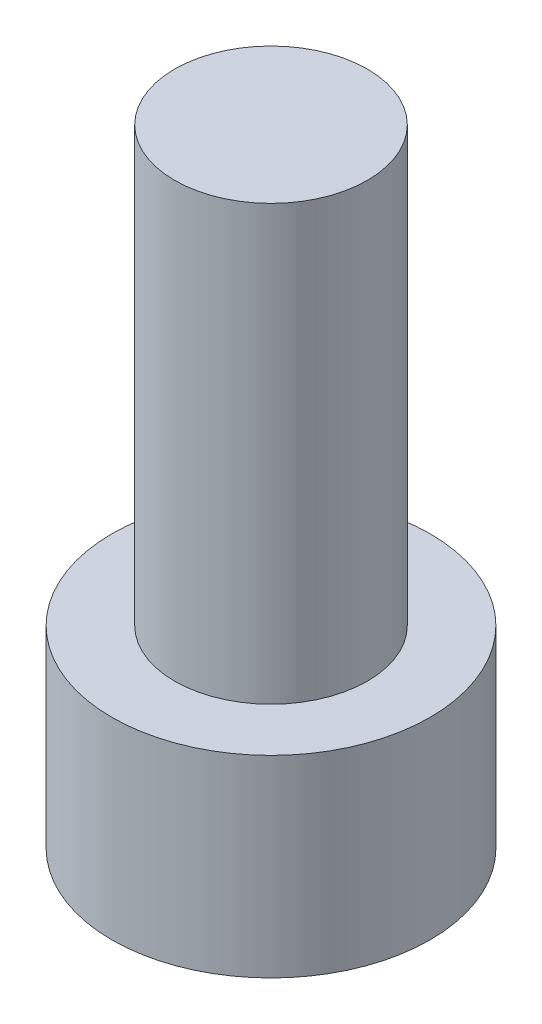
ISO-10303-21;
HEADER;
FILE_DESCRIPTION(('STEP AP214'),'2;1');
FILE_NAME('part.step','',(''),(''),'','','');
FILE_SCHEMA(('AUTOMOTIVE_DESIGN { 1 0 10303 214 1 1 1 1 }'));
ENDSEC;
DATA;
#1=APPLICATION_CONTEXT('core data for automotive mechanical design processes');
#2=APPLICATION_PROTOCOL_DEFINITION('international standard','automotive_design',2000,#1);
#3=PRODUCT_CONTEXT('',#1,'mechanical');
#4=PRODUCT('Part','Part','',(#3));
#5=PRODUCT_RELATED_PRODUCT_CATEGORY('part','',(#4));
#6=PRODUCT_DEFINITION_FORMATION('','',#4);
#7=PRODUCT_DEFINITION_CONTEXT('part definition',#1,'design');
#8=PRODUCT_DEFINITION('design','',#6,#7);
#9=PRODUCT_DEFINITION_SHAPE('','',#8);
#10=(LENGTH_UNIT() NAMED_UNIT(*) SI_UNIT(.MILLI.,.METRE.));
#11=(NAMED_UNIT(*) PLANE_ANGLE_UNIT() SI_UNIT($,.RADIAN.));
#12=(NAMED_UNIT(*) SI_UNIT($,.STERADIAN.) SOLID_ANGLE_UNIT());
#13=UNCERTAINTY_MEASURE_WITH_UNIT(LENGTH_MEASURE(1.E-05),#10,'distance_accuracy_value','');
#14=(GEOMETRIC_REPRESENTATION_CONTEXT(3) GLOBAL_UNCERTAINTY_ASSIGNED_CONTEXT((#13)) GLOBAL_UNIT_ASSIGNED_CONTEXT((#10,
#11,#12)) REPRESENTATION_CONTEXT('',''));
#15=CARTESIAN_POINT('',(0.,0.,0.));
#16=DIRECTION('',(0.,0.,1.));
#17=DIRECTION('',(1.,0.,0.));
#18=AXIS2_PLACEMENT_3D('',#15,#16,#17);
#19=CARTESIAN_POINT('',(0.,8.,0.));
#20=DIRECTION('',(0.,-1.,0.));
#21=DIRECTION('',(0.,0.,-1.));
#22=AXIS2_PLACEMENT_3D('',#19,#20,#21);
#23=CYLINDRICAL_SURFACE('',#22,6.6);
#24=CARTESIAN_POINT('',(0.,8.,0.));
#25=DIRECTION('',(0.,1.,0.));
#26=DIRECTION('',(0.,0.,1.));
#27=AXIS2_PLACEMENT_3D('',#24,#25,#26);
#28=CIRCLE('',#27,6.6);
#29=CARTESIAN_POINT('',(0.,8.,6.6));
#30=VERTEX_POINT('',#29);
#31=EDGE_CURVE('E51',#30,#30,#28,.T.);
#32=ORIENTED_EDGE('',*,*,#31,.F.);
#33=EDGE_LOOP('',(#32));
#34=FACE_BOUND('',#33,.T.);
#35=CARTESIAN_POINT('',(0.,0.,0.));
#36=DIRECTION('',(0.,1.,0.));
#37=DIRECTION('',(0.,0.,1.));
#38=AXIS2_PLACEMENT_3D('',#35,#36,#37);
#39=CIRCLE('',#38,6.6);
#40=CARTESIAN_POINT('',(0.,0.,6.6));
#41=VERTEX_POINT('',#40);
#42=EDGE_CURVE('E46',#41,#41,#39,.T.);
#43=ORIENTED_EDGE('',*,*,#42,.T.);
#44=EDGE_LOOP('',(#43));
#45=FACE_BOUND('',#44,.T.);
#46=ADVANCED_FACE('F43',(#34,#45),#23,.T.);
#47=CARTESIAN_POINT('',(0.,8.,0.));
#48=DIRECTION('',(0.,1.,0.));
#49=DIRECTION('',(0.,0.,1.));
#50=AXIS2_PLACEMENT_3D('',#47,#48,#49);
#51=PLANE('',#50);
#52=CARTESIAN_POINT('',(0.,8.,0.));
#53=DIRECTION('',(0.,1.,0.));
#54=DIRECTION('',(0.,0.,1.));
#55=AXIS2_PLACEMENT_3D('',#52,#53,#54);
#56=CIRCLE('',#55,4.);
#57=CARTESIAN_POINT('',(0.,8.,4.));
#58=VERTEX_POINT('',#57);
#59=EDGE_CURVE('E11',#58,#58,#56,.T.);
#60=ORIENTED_EDGE('',*,*,#59,.F.);
#61=EDGE_LOOP('',(#60));
#62=FACE_BOUND('',#61,.T.);
#63=ORIENTED_EDGE('',*,*,#31,.T.);
#64=EDGE_LOOP('',(#63));
#65=FACE_BOUND('',#64,.T.);
#66=ADVANCED_FACE('F162',(#62,#65),#51,.T.);
#67=CARTESIAN_POINT('',(0.,0.,0.));
#68=DIRECTION('',(0.,1.,0.));
#69=DIRECTION('',(0.,0.,1.));
#70=AXIS2_PLACEMENT_3D('',#67,#68,#69);
#71=PLANE('',#70);
#72=DIRECTION('',(-0.538335131951045,0.,0.842730850098209));
#73=VECTOR('',#72,1.);
#74=CARTESIAN_POINT('',(3.46061635033313,0.,0.155352746377327));
#75=LINE('',#74,#73);
#76=CARTESIAN_POINT('',(3.46061635033313,0.,0.155352746377328));
#77=VERTEX_POINT('',#76);
#78=CARTESIAN_POINT('',(1.59576875025612,0.,3.07465804532895));
#79=VERTEX_POINT('',#78);
#80=EDGE_CURVE('E135',#77,#79,#75,.T.);
#81=ORIENTED_EDGE('',*,*,#80,.F.);
#82=DIRECTION('',(0.460658758762382,0.,0.887577325068358));
#83=VECTOR('',#82,1.);
#84=CARTESIAN_POINT('',(1.86484760007701,0.,-2.91930529895162));
#85=LINE('',#84,#83);
#86=CARTESIAN_POINT('',(1.86484760007701,0.,-2.91930529895162));
#87=VERTEX_POINT('',#86);
#88=EDGE_CURVE('E56',#87,#77,#85,.T.);
#89=ORIENTED_EDGE('',*,*,#88,.F.);
#90=DIRECTION('',(0.998993890713428,0.,0.0448464749701485));
#91=VECTOR('',#90,1.);
#92=CARTESIAN_POINT('',(-1.59576875025612,0.,-3.07465804532894));
#93=LINE('',#92,#91);
#94=CARTESIAN_POINT('',(-1.59576875025612,0.,-3.07465804532894));
#95=VERTEX_POINT('',#94);
#96=EDGE_CURVE('E142',#95,#87,#93,.T.);
#97=ORIENTED_EDGE('',*,*,#96,.F.);
#98=DIRECTION('',(0.538335131951046,0.,-0.842730850098209));
#99=VECTOR('',#98,1.);
#100=CARTESIAN_POINT('',(-3.46061635033313,0.,-0.155352746377328));
#101=LINE('',#100,#99);
#102=CARTESIAN_POINT('',(-3.46061635033313,0.,-0.155352746377328));
#103=VERTEX_POINT('',#102);
#104=EDGE_CURVE('E138',#103,#95,#101,.T.);
#105=ORIENTED_EDGE('',*,*,#104,.F.);
#106=DIRECTION('',(-0.460658758762382,0.,-0.887577325068358));
#107=VECTOR('',#106,1.);
#108=CARTESIAN_POINT('',(-1.86484760007701,0.,2.91930529895162));
#109=LINE('',#108,#107);
#110=CARTESIAN_POINT('',(-1.86484760007701,0.,2.91930529895162));
#111=VERTEX_POINT('',#110);
#112=EDGE_CURVE('E110',#111,#103,#109,.T.);
#113=ORIENTED_EDGE('',*,*,#112,.F.);
#114=DIRECTION('',(-0.998993890713428,0.,-0.0448464749701483));
#115=VECTOR('',#114,1.);
#116=CARTESIAN_POINT('',(1.59576875025612,0.,3.07465804532895));
#117=LINE('',#116,#115);
#118=EDGE_CURVE('E137',#79,#111,#117,.T.);
#119=ORIENTED_EDGE('',*,*,#118,.F.);
#120=EDGE_LOOP('',(#81,#89,#97,#105,#113,#119));
#121=FACE_BOUND('',#120,.T.);
#122=ORIENTED_EDGE('',*,*,#42,.F.);
#123=EDGE_LOOP('',(#122));
#124=FACE_BOUND('',#123,.T.);
#125=ADVANCED_FACE('F159',(#121,#124),#71,.F.);
#126=CARTESIAN_POINT('',(0.,26.,0.));
#127=DIRECTION('',(0.,-1.,0.));
#128=DIRECTION('',(0.,0.,-1.));
#129=AXIS2_PLACEMENT_3D('',#126,#127,#128);
#130=CYLINDRICAL_SURFACE('',#129,4.);
#131=CARTESIAN_POINT('',(0.,26.,0.));
#132=DIRECTION('',(0.,1.,0.));
#133=DIRECTION('',(0.,0.,1.));
#134=AXIS2_PLACEMENT_3D('',#131,#132,#133);
#135=CIRCLE('',#134,4.);
#136=CARTESIAN_POINT('',(0.,26.,4.));
#137=VERTEX_POINT('',#136);
#138=EDGE_CURVE('E148',#137,#137,#135,.T.);
#139=ORIENTED_EDGE('',*,*,#138,.F.);
#140=EDGE_LOOP('',(#139));
#141=FACE_BOUND('',#140,.T.);
#142=ORIENTED_EDGE('',*,*,#59,.T.);
#143=EDGE_LOOP('',(#142));
#144=FACE_BOUND('',#143,.T.);
#145=ADVANCED_FACE('F165',(#141,#144),#130,.T.);
#146=CARTESIAN_POINT('',(0.,26.,0.));
#147=DIRECTION('',(0.,1.,0.));
#148=DIRECTION('',(0.,0.,1.));
#149=AXIS2_PLACEMENT_3D('',#146,#147,#148);
#150=PLANE('',#149);
#151=ORIENTED_EDGE('',*,*,#138,.T.);
#152=EDGE_LOOP('',(#151));
#153=FACE_BOUND('',#152,.T.);
#154=ADVANCED_FACE('F168',(#153),#150,.T.);
#155=CARTESIAN_POINT('',(1.86484760007701,4.,-2.91930529895162));
#156=DIRECTION('',(0.887577325068358,0.,-0.460658758762382));
#157=DIRECTION('',(-0.460658758762382,0.,-0.887577325068358));
#158=AXIS2_PLACEMENT_3D('',#155,#156,#157);
#159=PLANE('',#158);
#160=ORIENTED_EDGE('',*,*,#88,.T.);
#161=DIRECTION('',(0.,-1.,0.));
#162=VECTOR('',#161,1.);
#163=CARTESIAN_POINT('',(3.46061635033313,4.,0.155352746377327));
#164=LINE('',#163,#162);
#165=CARTESIAN_POINT('',(3.46061635033313,4.,0.155352746377327));
#166=VERTEX_POINT('',#165);
#167=EDGE_CURVE('E90',#166,#77,#164,.T.);
#168=ORIENTED_EDGE('',*,*,#167,.F.);
#169=DIRECTION('',(0.460658758762382,0.,0.887577325068358));
#170=VECTOR('',#169,1.);
#171=CARTESIAN_POINT('',(1.86484760007701,4.,-2.91930529895162));
#172=LINE('',#171,#170);
#173=CARTESIAN_POINT('',(1.86484760007701,4.,-2.91930529895162));
#174=VERTEX_POINT('',#173);
#175=EDGE_CURVE('E145',#174,#166,#172,.T.);
#176=ORIENTED_EDGE('',*,*,#175,.F.);
#177=DIRECTION('',(0.,-1.,0.));
#178=VECTOR('',#177,1.);
#179=CARTESIAN_POINT('',(1.86484760007701,4.,-2.91930529895162));
#180=LINE('',#179,#178);
#181=EDGE_CURVE('E70',#174,#87,#180,.T.);
#182=ORIENTED_EDGE('',*,*,#181,.T.);
#183=EDGE_LOOP('',(#160,#168,#176,#182));
#184=FACE_BOUND('',#183,.T.);
#185=ADVANCED_FACE('F196',(#184),#159,.F.);
#186=CARTESIAN_POINT('',(-1.59576875025612,4.,-3.07465804532894));
#187=DIRECTION('',(0.0448464749701485,0.,-0.998993890713428));
#188=DIRECTION('',(-0.998993890713428,0.,-0.0448464749701485));
#189=AXIS2_PLACEMENT_3D('',#186,#187,#188);
#190=PLANE('',#189);
#191=ORIENTED_EDGE('',*,*,#96,.T.);
#192=ORIENTED_EDGE('',*,*,#181,.F.);
#193=DIRECTION('',(0.998993890713428,0.,0.0448464749701485));
#194=VECTOR('',#193,1.);
#195=CARTESIAN_POINT('',(-1.59576875025612,4.,-3.07465804532894));
#196=LINE('',#195,#194);
#197=CARTESIAN_POINT('',(-1.59576875025612,4.,-3.07465804532894));
#198=VERTEX_POINT('',#197);
#199=EDGE_CURVE('E116',#198,#174,#196,.T.);
#200=ORIENTED_EDGE('',*,*,#199,.F.);
#201=DIRECTION('',(0.,-1.,0.));
#202=VECTOR('',#201,1.);
#203=CARTESIAN_POINT('',(-1.59576875025612,4.,-3.07465804532894));
#204=LINE('',#203,#202);
#205=EDGE_CURVE('E112',#198,#95,#204,.T.);
#206=ORIENTED_EDGE('',*,*,#205,.T.);
#207=EDGE_LOOP('',(#191,#192,#200,#206));
#208=FACE_BOUND('',#207,.T.);
#209=ADVANCED_FACE('F209',(#208),#190,.F.);
#210=CARTESIAN_POINT('',(-3.46061635033313,4.,-0.155352746377328));
#211=DIRECTION('',(-0.842730850098209,0.,-0.538335131951046));
#212=DIRECTION('',(-0.538335131951046,0.,0.842730850098209));
#213=AXIS2_PLACEMENT_3D('',#210,#211,#212);
#214=PLANE('',#213);
#215=ORIENTED_EDGE('',*,*,#104,.T.);
#216=ORIENTED_EDGE('',*,*,#205,.F.);
#217=DIRECTION('',(0.538335131951046,0.,-0.842730850098209));
#218=VECTOR('',#217,1.);
#219=CARTESIAN_POINT('',(-3.46061635033313,4.,-0.155352746377328));
#220=LINE('',#219,#218);
#221=CARTESIAN_POINT('',(-3.46061635033313,4.,-0.155352746377328));
#222=VERTEX_POINT('',#221);
#223=EDGE_CURVE('E113',#222,#198,#220,.T.);
#224=ORIENTED_EDGE('',*,*,#223,.F.);
#225=DIRECTION('',(0.,-1.,0.));
#226=VECTOR('',#225,1.);
#227=CARTESIAN_POINT('',(-3.46061635033313,4.,-0.155352746377328));
#228=LINE('',#227,#226);
#229=EDGE_CURVE('E99',#222,#103,#228,.T.);
#230=ORIENTED_EDGE('',*,*,#229,.T.);
#231=EDGE_LOOP('',(#215,#216,#224,#230));
#232=FACE_BOUND('',#231,.T.);
#233=ADVANCED_FACE('F117',(#232),#214,.F.);
#234=CARTESIAN_POINT('',(-1.86484760007701,4.,2.91930529895162));
#235=DIRECTION('',(-0.887577325068358,0.,0.460658758762382));
#236=DIRECTION('',(0.460658758762382,0.,0.887577325068358));
#237=AXIS2_PLACEMENT_3D('',#234,#235,#236);
#238=PLANE('',#237);
#239=ORIENTED_EDGE('',*,*,#112,.T.);
#240=ORIENTED_EDGE('',*,*,#229,.F.);
#241=DIRECTION('',(-0.460658758762382,0.,-0.887577325068358));
#242=VECTOR('',#241,1.);
#243=CARTESIAN_POINT('',(-1.86484760007701,4.,2.91930529895162));
#244=LINE('',#243,#242);
#245=CARTESIAN_POINT('',(-1.86484760007701,4.,2.91930529895162));
#246=VERTEX_POINT('',#245);
#247=EDGE_CURVE('E102',#246,#222,#244,.T.);
#248=ORIENTED_EDGE('',*,*,#247,.F.);
#249=DIRECTION('',(0.,-1.,0.));
#250=VECTOR('',#249,1.);
#251=CARTESIAN_POINT('',(-1.86484760007701,4.,2.91930529895162));
#252=LINE('',#251,#250);
#253=EDGE_CURVE('E115',#246,#111,#252,.T.);
#254=ORIENTED_EDGE('',*,*,#253,.T.);
#255=EDGE_LOOP('',(#239,#240,#248,#254));
#256=FACE_BOUND('',#255,.T.);
#257=ADVANCED_FACE('F105',(#256),#238,.F.);
#258=CARTESIAN_POINT('',(1.59576875025612,4.,3.07465804532895));
#259=DIRECTION('',(-0.0448464749701483,0.,0.998993890713428));
#260=DIRECTION('',(0.998993890713428,0.,0.0448464749701483));
#261=AXIS2_PLACEMENT_3D('',#258,#259,#260);
#262=PLANE('',#261);
#263=ORIENTED_EDGE('',*,*,#118,.T.);
#264=ORIENTED_EDGE('',*,*,#253,.F.);
#265=DIRECTION('',(-0.998993890713428,0.,-0.0448464749701483));
#266=VECTOR('',#265,1.);
#267=CARTESIAN_POINT('',(1.59576875025612,4.,3.07465804532895));
#268=LINE('',#267,#266);
#269=CARTESIAN_POINT('',(1.59576875025612,4.,3.07465804532895));
#270=VERTEX_POINT('',#269);
#271=EDGE_CURVE('E123',#270,#246,#268,.T.);
#272=ORIENTED_EDGE('',*,*,#271,.F.);
#273=DIRECTION('',(0.,-1.,0.));
#274=VECTOR('',#273,1.);
#275=CARTESIAN_POINT('',(1.59576875025612,4.,3.07465804532895));
#276=LINE('',#275,#274);
#277=EDGE_CURVE('E149',#270,#79,#276,.T.);
#278=ORIENTED_EDGE('',*,*,#277,.T.);
#279=EDGE_LOOP('',(#263,#264,#272,#278));
#280=FACE_BOUND('',#279,.T.);
#281=ADVANCED_FACE('F233',(#280),#262,.F.);
#282=CARTESIAN_POINT('',(3.46061635033313,4.,0.155352746377327));
#283=DIRECTION('',(0.842730850098209,0.,0.538335131951045));
#284=DIRECTION('',(0.538335131951045,0.,-0.842730850098209));
#285=AXIS2_PLACEMENT_3D('',#282,#283,#284);
#286=PLANE('',#285);
#287=ORIENTED_EDGE('',*,*,#80,.T.);
#288=ORIENTED_EDGE('',*,*,#277,.F.);
#289=DIRECTION('',(-0.538335131951045,0.,0.842730850098209));
#290=VECTOR('',#289,1.);
#291=CARTESIAN_POINT('',(3.46061635033313,4.,0.155352746377327));
#292=LINE('',#291,#290);
#293=EDGE_CURVE('E130',#166,#270,#292,.T.);
#294=ORIENTED_EDGE('',*,*,#293,.F.);
#295=ORIENTED_EDGE('',*,*,#167,.T.);
#296=EDGE_LOOP('',(#287,#288,#294,#295));
#297=FACE_BOUND('',#296,.T.);
#298=ADVANCED_FACE('F241',(#297),#286,.F.);
#299=CARTESIAN_POINT('',(0.,4.,0.));
#300=DIRECTION('',(0.,-1.,0.));
#301=DIRECTION('',(0.,0.,-1.));
#302=AXIS2_PLACEMENT_3D('',#299,#300,#301);
#303=PLANE('',#302);
#304=ORIENTED_EDGE('',*,*,#175,.T.);
#305=ORIENTED_EDGE('',*,*,#293,.T.);
#306=ORIENTED_EDGE('',*,*,#271,.T.);
#307=ORIENTED_EDGE('',*,*,#247,.T.);
#308=ORIENTED_EDGE('',*,*,#223,.T.);
#309=ORIENTED_EDGE('',*,*,#199,.T.);
#310=EDGE_LOOP('',(#304,#305,#306,#307,#308,#309));
#311=FACE_BOUND('',#310,.T.);
#312=ADVANCED_FACE('F125',(#311),#303,.T.);
#313=CLOSED_SHELL('',(#46,#66,#125,#145,#154,#185,#209,#233,#257,#281,#298,#312));
#314=MANIFOLD_SOLID_BREP('B2',#313);
#315=ADVANCED_BREP_SHAPE_REPRESENTATION('',(#18,#314),#14);
#316=SHAPE_DEFINITION_REPRESENTATION(#9,#315);
ENDSEC;
END-ISO-10303-21;
